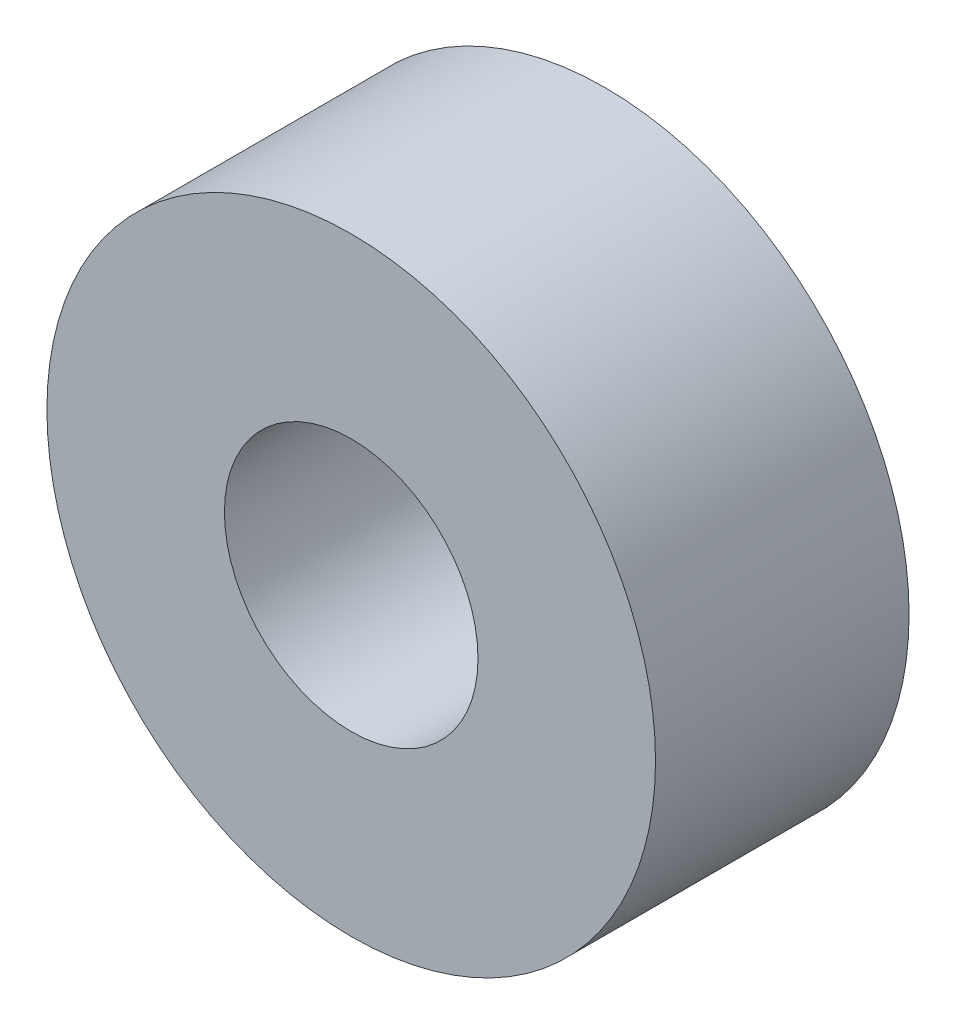
ISO-10303-21;
HEADER;
FILE_DESCRIPTION(('STEP AP214'),'2;1');
FILE_NAME('part.step','',(''),(''),'','','');
FILE_SCHEMA(('AUTOMOTIVE_DESIGN { 1 0 10303 214 1 1 1 1 }'));
ENDSEC;
DATA;
#1=APPLICATION_CONTEXT('core data for automotive mechanical design processes');
#2=APPLICATION_PROTOCOL_DEFINITION('international standard','automotive_design',2000,#1);
#3=PRODUCT_CONTEXT('',#1,'mechanical');
#4=PRODUCT('Part','Part','',(#3));
#5=PRODUCT_RELATED_PRODUCT_CATEGORY('part','',(#4));
#6=PRODUCT_DEFINITION_FORMATION('','',#4);
#7=PRODUCT_DEFINITION_CONTEXT('part definition',#1,'design');
#8=PRODUCT_DEFINITION('design','',#6,#7);
#9=PRODUCT_DEFINITION_SHAPE('','',#8);
#10=(LENGTH_UNIT() NAMED_UNIT(*) SI_UNIT(.MILLI.,.METRE.));
#11=(NAMED_UNIT(*) PLANE_ANGLE_UNIT() SI_UNIT($,.RADIAN.));
#12=(NAMED_UNIT(*) SI_UNIT($,.STERADIAN.) SOLID_ANGLE_UNIT());
#13=UNCERTAINTY_MEASURE_WITH_UNIT(LENGTH_MEASURE(1.E-05),#10,'distance_accuracy_value','');
#14=(GEOMETRIC_REPRESENTATION_CONTEXT(3) GLOBAL_UNCERTAINTY_ASSIGNED_CONTEXT((#13)) GLOBAL_UNIT_ASSIGNED_CONTEXT((#10,
#11,#12)) REPRESENTATION_CONTEXT('',''));
#15=CARTESIAN_POINT('',(0.,0.,0.));
#16=DIRECTION('',(0.,0.,1.));
#17=DIRECTION('',(1.,0.,0.));
#18=AXIS2_PLACEMENT_3D('',#15,#16,#17);
#19=CARTESIAN_POINT('',(0.,0.,5.));
#20=DIRECTION('',(0.,0.,1.));
#21=DIRECTION('',(1.,0.,0.));
#22=AXIS2_PLACEMENT_3D('',#19,#20,#21);
#23=PLANE('',#22);
#24=CARTESIAN_POINT('',(0.,0.,5.));
#25=DIRECTION('',(0.,0.,1.));
#26=DIRECTION('',(1.,0.,0.));
#27=AXIS2_PLACEMENT_3D('',#24,#25,#26);
#28=CIRCLE('',#27,12.);
#29=CARTESIAN_POINT('',(12.,0.,5.));
#30=VERTEX_POINT('',#29);
#31=EDGE_CURVE('E10',#30,#30,#28,.T.);
#32=ORIENTED_EDGE('',*,*,#31,.T.);
#33=EDGE_LOOP('',(#32));
#34=FACE_BOUND('',#33,.T.);
#35=CARTESIAN_POINT('',(0.,0.,5.));
#36=DIRECTION('',(0.,0.,1.));
#37=DIRECTION('',(1.,0.,0.));
#38=AXIS2_PLACEMENT_3D('',#35,#36,#37);
#39=CIRCLE('',#38,5.);
#40=CARTESIAN_POINT('',(5.,0.,5.));
#41=VERTEX_POINT('',#40);
#42=EDGE_CURVE('E45',#41,#41,#39,.T.);
#43=ORIENTED_EDGE('',*,*,#42,.F.);
#44=EDGE_LOOP('',(#43));
#45=FACE_BOUND('',#44,.T.);
#46=ADVANCED_FACE('F34',(#34,#45),#23,.T.);
#47=CARTESIAN_POINT('',(0.,0.,-5.));
#48=DIRECTION('',(0.,0.,1.));
#49=DIRECTION('',(1.,0.,0.));
#50=AXIS2_PLACEMENT_3D('',#47,#48,#49);
#51=PLANE('',#50);
#52=CARTESIAN_POINT('',(0.,0.,-5.));
#53=DIRECTION('',(0.,0.,1.));
#54=DIRECTION('',(1.,0.,0.));
#55=AXIS2_PLACEMENT_3D('',#52,#53,#54);
#56=CIRCLE('',#55,12.);
#57=CARTESIAN_POINT('',(12.,0.,-5.));
#58=VERTEX_POINT('',#57);
#59=EDGE_CURVE('E38',#58,#58,#56,.T.);
#60=ORIENTED_EDGE('',*,*,#59,.F.);
#61=EDGE_LOOP('',(#60));
#62=FACE_BOUND('',#61,.T.);
#63=CARTESIAN_POINT('',(0.,0.,-5.));
#64=DIRECTION('',(0.,0.,1.));
#65=DIRECTION('',(1.,0.,0.));
#66=AXIS2_PLACEMENT_3D('',#63,#64,#65);
#67=CIRCLE('',#66,5.);
#68=CARTESIAN_POINT('',(5.,0.,-5.));
#69=VERTEX_POINT('',#68);
#70=EDGE_CURVE('E47',#69,#69,#67,.T.);
#71=ORIENTED_EDGE('',*,*,#70,.T.);
#72=EDGE_LOOP('',(#71));
#73=FACE_BOUND('',#72,.T.);
#74=ADVANCED_FACE('F57',(#62,#73),#51,.F.);
#75=CARTESIAN_POINT('',(0.,0.,5.));
#76=DIRECTION('',(0.,0.,-1.));
#77=DIRECTION('',(-1.,0.,0.));
#78=AXIS2_PLACEMENT_3D('',#75,#76,#77);
#79=CYLINDRICAL_SURFACE('',#78,12.);
#80=ORIENTED_EDGE('',*,*,#31,.F.);
#81=EDGE_LOOP('',(#80));
#82=FACE_BOUND('',#81,.T.);
#83=ORIENTED_EDGE('',*,*,#59,.T.);
#84=EDGE_LOOP('',(#83));
#85=FACE_BOUND('',#84,.T.);
#86=ADVANCED_FACE('F36',(#82,#85),#79,.T.);
#87=CARTESIAN_POINT('',(0.,0.,5.));
#88=DIRECTION('',(0.,0.,-1.));
#89=DIRECTION('',(-1.,0.,0.));
#90=AXIS2_PLACEMENT_3D('',#87,#88,#89);
#91=CYLINDRICAL_SURFACE('',#90,5.);
#92=ORIENTED_EDGE('',*,*,#42,.T.);
#93=EDGE_LOOP('',(#92));
#94=FACE_BOUND('',#93,.T.);
#95=ORIENTED_EDGE('',*,*,#70,.F.);
#96=EDGE_LOOP('',(#95));
#97=FACE_BOUND('',#96,.T.);
#98=ADVANCED_FACE('F53',(#94,#97),#91,.F.);
#99=CLOSED_SHELL('',(#46,#74,#86,#98));
#100=MANIFOLD_SOLID_BREP('B2',#99);
#101=ADVANCED_BREP_SHAPE_REPRESENTATION('',(#18,#100),#14);
#102=SHAPE_DEFINITION_REPRESENTATION(#9,#101);
ENDSEC;
END-ISO-10303-21;
